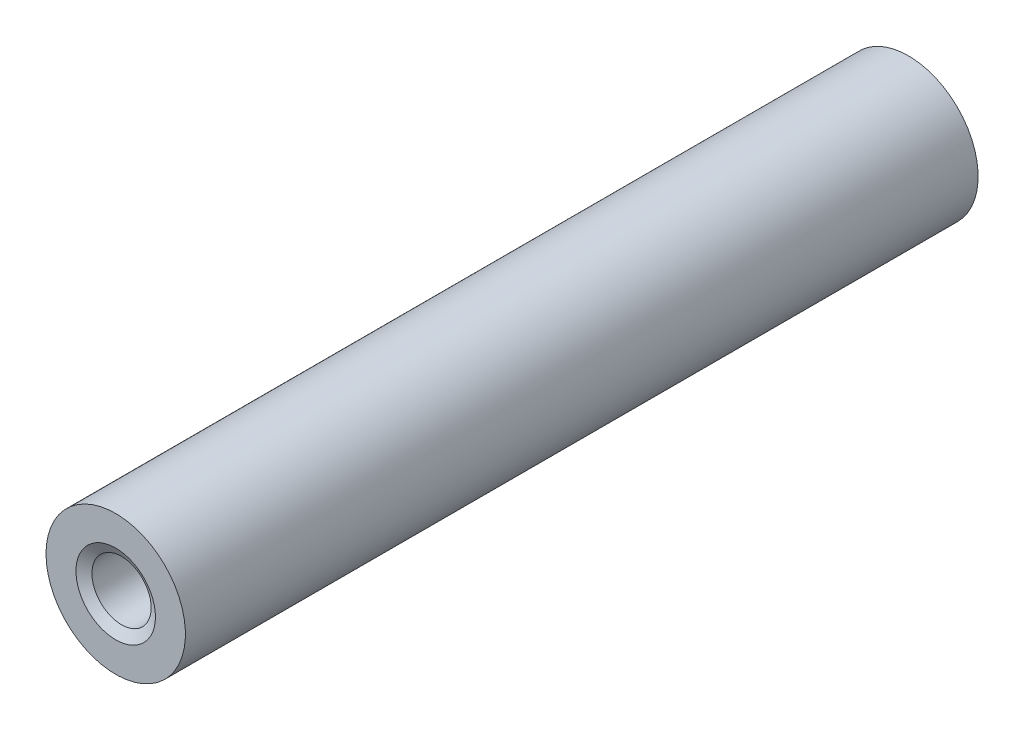
ISO-10303-21;
HEADER;
FILE_DESCRIPTION(('STEP AP214'),'2;1');
FILE_NAME('part.step','',(''),(''),'','','');
FILE_SCHEMA(('AUTOMOTIVE_DESIGN { 1 0 10303 214 1 1 1 1 }'));
ENDSEC;
DATA;
#1=APPLICATION_CONTEXT('core data for automotive mechanical design processes');
#2=APPLICATION_PROTOCOL_DEFINITION('international standard','automotive_design',2000,#1);
#3=PRODUCT_CONTEXT('',#1,'mechanical');
#4=PRODUCT('Part','Part','',(#3));
#5=PRODUCT_RELATED_PRODUCT_CATEGORY('part','',(#4));
#6=PRODUCT_DEFINITION_FORMATION('','',#4);
#7=PRODUCT_DEFINITION_CONTEXT('part definition',#1,'design');
#8=PRODUCT_DEFINITION('design','',#6,#7);
#9=PRODUCT_DEFINITION_SHAPE('','',#8);
#10=(LENGTH_UNIT() NAMED_UNIT(*) SI_UNIT(.MILLI.,.METRE.));
#11=(NAMED_UNIT(*) PLANE_ANGLE_UNIT() SI_UNIT($,.RADIAN.));
#12=(NAMED_UNIT(*) SI_UNIT($,.STERADIAN.) SOLID_ANGLE_UNIT());
#13=UNCERTAINTY_MEASURE_WITH_UNIT(LENGTH_MEASURE(1.E-05),#10,'distance_accuracy_value','');
#14=(GEOMETRIC_REPRESENTATION_CONTEXT(3) GLOBAL_UNCERTAINTY_ASSIGNED_CONTEXT((#13)) GLOBAL_UNIT_ASSIGNED_CONTEXT((#10,
#11,#12)) REPRESENTATION_CONTEXT('',''));
#15=CARTESIAN_POINT('',(0.,0.,0.));
#16=DIRECTION('',(0.,0.,1.));
#17=DIRECTION('',(1.,0.,0.));
#18=AXIS2_PLACEMENT_3D('',#15,#16,#17);
#19=CARTESIAN_POINT('',(241.510652388511,-401.151572168843,-643.087499999979));
#20=DIRECTION('',(0.,0.,-1.));
#21=DIRECTION('',(-1.,0.,0.));
#22=AXIS2_PLACEMENT_3D('',#19,#20,#21);
#23=CONICAL_SURFACE('',#22,3.39999999994048,1.02974425863138);
#24=CARTESIAN_POINT('',(241.510652388399,-401.151572168843,-641.044573895215));
#25=VERTEX_POINT('',#24);
#26=VERTEX_LOOP('',#25);
#27=FACE_BOUND('',#26,.T.);
#28=CARTESIAN_POINT('',(241.510652388511,-401.151572168843,-643.0875));
#29=DIRECTION('',(0.,0.,-1.));
#30=DIRECTION('',(-1.,0.,0.));
#31=AXIS2_PLACEMENT_3D('',#28,#29,#30);
#32=CIRCLE('',#31,3.4);
#33=CARTESIAN_POINT('',(238.110652388511,-401.151572168843,-643.0875));
#34=VERTEX_POINT('',#33);
#35=EDGE_CURVE('E38',#34,#34,#32,.T.);
#36=ORIENTED_EDGE('',*,*,#35,.T.);
#37=EDGE_LOOP('',(#36));
#38=FACE_BOUND('',#37,.T.);
#39=ADVANCED_FACE('F17',(#27,#38),#23,.F.);
#40=CARTESIAN_POINT('',(241.510652388511,-401.151572168843,-599.087500000053));
#41=DIRECTION('',(0.,0.,1.));
#42=DIRECTION('',(1.,0.,0.));
#43=AXIS2_PLACEMENT_3D('',#40,#41,#42);
#44=CONICAL_SURFACE('',#43,3.3999999999442,1.02974425864463);
#45=CARTESIAN_POINT('',(241.510652388456,-401.151572168843,-601.130426104731));
#46=VERTEX_POINT('',#45);
#47=VERTEX_LOOP('',#46);
#48=FACE_BOUND('',#47,.T.);
#49=CARTESIAN_POINT('',(241.510652388511,-401.151572168843,-599.0875));
#50=DIRECTION('',(0.,0.,1.));
#51=DIRECTION('',(1.,0.,0.));
#52=AXIS2_PLACEMENT_3D('',#49,#50,#51);
#53=CIRCLE('',#52,3.4);
#54=CARTESIAN_POINT('',(244.910652388511,-401.151572168843,-599.0875));
#55=VERTEX_POINT('',#54);
#56=EDGE_CURVE('E41',#55,#55,#53,.T.);
#57=ORIENTED_EDGE('',*,*,#56,.T.);
#58=EDGE_LOOP('',(#57));
#59=FACE_BOUND('',#58,.T.);
#60=ADVANCED_FACE('F35',(#48,#59),#44,.F.);
#61=CARTESIAN_POINT('',(241.510652388511,-401.151572168843,-666.5875));
#62=DIRECTION('',(0.,0.,-1.));
#63=DIRECTION('',(-1.,0.,0.));
#64=AXIS2_PLACEMENT_3D('',#61,#62,#63);
#65=CYLINDRICAL_SURFACE('',#64,3.4);
#66=ORIENTED_EDGE('',*,*,#35,.F.);
#67=EDGE_LOOP('',(#66));
#68=FACE_BOUND('',#67,.T.);
#69=CARTESIAN_POINT('',(241.510652388511,-401.151572168843,-665.916330312086));
#70=DIRECTION('',(0.,0.,-1.));
#71=DIRECTION('',(-1.,0.,0.));
#72=AXIS2_PLACEMENT_3D('',#69,#70,#71);
#73=CIRCLE('',#72,3.40000000005417);
#74=CARTESIAN_POINT('',(238.110652388457,-401.151572168843,-665.916330312086));
#75=VERTEX_POINT('',#74);
#76=EDGE_CURVE('E46',#75,#75,#73,.T.);
#77=ORIENTED_EDGE('',*,*,#76,.T.);
#78=EDGE_LOOP('',(#77));
#79=FACE_BOUND('',#78,.T.);
#80=ADVANCED_FACE('F71',(#68,#79),#65,.F.);
#81=CARTESIAN_POINT('',(241.510652388511,-401.151572168843,-575.5875));
#82=DIRECTION('',(0.,0.,1.));
#83=DIRECTION('',(1.,0.,0.));
#84=AXIS2_PLACEMENT_3D('',#81,#82,#83);
#85=CYLINDRICAL_SURFACE('',#84,3.4);
#86=ORIENTED_EDGE('',*,*,#56,.F.);
#87=EDGE_LOOP('',(#86));
#88=FACE_BOUND('',#87,.T.);
#89=CARTESIAN_POINT('',(241.510652388511,-401.151572168843,-576.258669688002));
#90=DIRECTION('',(0.,0.,1.));
#91=DIRECTION('',(1.,0.,0.));
#92=AXIS2_PLACEMENT_3D('',#89,#90,#91);
#93=CIRCLE('',#92,3.40000000000104);
#94=CARTESIAN_POINT('',(244.910652388512,-401.151572168843,-576.258669688002));
#95=VERTEX_POINT('',#94);
#96=EDGE_CURVE('E59',#95,#95,#93,.T.);
#97=ORIENTED_EDGE('',*,*,#96,.T.);
#98=EDGE_LOOP('',(#97));
#99=FACE_BOUND('',#98,.T.);
#100=ADVANCED_FACE('F76',(#88,#99),#85,.F.);
#101=CARTESIAN_POINT('',(241.510652388511,-401.151572168843,-666.587500000048));
#102=DIRECTION('',(0.,0.,-1.));
#103=DIRECTION('',(-1.,0.,0.));
#104=AXIS2_PLACEMENT_3D('',#101,#102,#103);
#105=CONICAL_SURFACE('',#104,4.56250000013184,1.04719755120679);
#106=CARTESIAN_POINT('',(241.510652388511,-401.151572168843,-666.587499999984));
#107=DIRECTION('',(0.,0.,-1.));
#108=DIRECTION('',(-1.,0.,0.));
#109=AXIS2_PLACEMENT_3D('',#106,#107,#108);
#110=CIRCLE('',#109,4.56250000002001);
#111=CARTESIAN_POINT('',(236.948152388491,-401.151572168843,-666.587499999984));
#112=VERTEX_POINT('',#111);
#113=EDGE_CURVE('E20',#112,#112,#110,.F.);
#114=ORIENTED_EDGE('',*,*,#113,.F.);
#115=EDGE_LOOP('',(#114));
#116=FACE_BOUND('',#115,.T.);
#117=ORIENTED_EDGE('',*,*,#76,.F.);
#118=EDGE_LOOP('',(#117));
#119=FACE_BOUND('',#118,.T.);
#120=ADVANCED_FACE('F73',(#116,#119),#105,.F.);
#121=CARTESIAN_POINT('',(241.510652388511,-401.151572168843,-575.58750000004));
#122=DIRECTION('',(0.,0.,1.));
#123=DIRECTION('',(1.,0.,0.));
#124=AXIS2_PLACEMENT_3D('',#121,#122,#123);
#125=CONICAL_SURFACE('',#124,4.56250000002187,1.04719755117994);
#126=CARTESIAN_POINT('',(241.510652388511,-401.151572168843,-575.587500000041));
#127=DIRECTION('',(0.,0.,1.));
#128=DIRECTION('',(1.,0.,0.));
#129=AXIS2_PLACEMENT_3D('',#126,#127,#128);
#130=CIRCLE('',#129,4.56250000002001);
#131=CARTESIAN_POINT('',(246.073152388531,-401.151572168843,-575.587500000041));
#132=VERTEX_POINT('',#131);
#133=EDGE_CURVE('E52',#132,#132,#130,.T.);
#134=ORIENTED_EDGE('',*,*,#133,.T.);
#135=EDGE_LOOP('',(#134));
#136=FACE_BOUND('',#135,.T.);
#137=ORIENTED_EDGE('',*,*,#96,.F.);
#138=EDGE_LOOP('',(#137));
#139=FACE_BOUND('',#138,.T.);
#140=ADVANCED_FACE('F75',(#136,#139),#125,.F.);
#141=CARTESIAN_POINT('',(401.510652388512,-401.151572168843,-666.5875));
#142=DIRECTION('',(0.,0.,-1.));
#143=DIRECTION('',(-1.,0.,0.));
#144=AXIS2_PLACEMENT_3D('',#141,#142,#143);
#145=PLANE('',#144);
#146=CARTESIAN_POINT('',(241.510652388512,-401.151572168843,-666.5875));
#147=DIRECTION('',(0.,0.,-1.));
#148=DIRECTION('',(-1.,0.,0.));
#149=AXIS2_PLACEMENT_3D('',#146,#147,#148);
#150=CIRCLE('',#149,8.);
#151=CARTESIAN_POINT('',(233.510652388512,-401.151572168843,-666.5875));
#152=VERTEX_POINT('',#151);
#153=EDGE_CURVE('E27',#152,#152,#150,.F.);
#154=ORIENTED_EDGE('',*,*,#153,.F.);
#155=EDGE_LOOP('',(#154));
#156=FACE_BOUND('',#155,.T.);
#157=ORIENTED_EDGE('',*,*,#113,.T.);
#158=EDGE_LOOP('',(#157));
#159=FACE_BOUND('',#158,.T.);
#160=ADVANCED_FACE('F83',(#156,#159),#145,.T.);
#161=CARTESIAN_POINT('',(476.510652388512,-354.095322168843,-575.5875));
#162=DIRECTION('',(0.,0.,-1.));
#163=DIRECTION('',(-1.,0.,0.));
#164=AXIS2_PLACEMENT_3D('',#161,#162,#163);
#165=PLANE('',#164);
#166=CARTESIAN_POINT('',(241.510652388512,-401.151572168843,-575.5875));
#167=DIRECTION('',(0.,0.,-1.));
#168=DIRECTION('',(-1.,0.,0.));
#169=AXIS2_PLACEMENT_3D('',#166,#167,#168);
#170=CIRCLE('',#169,8.);
#171=CARTESIAN_POINT('',(233.510652388512,-401.151572168843,-575.5875));
#172=VERTEX_POINT('',#171);
#173=EDGE_CURVE('E11',#172,#172,#170,.T.);
#174=ORIENTED_EDGE('',*,*,#173,.F.);
#175=EDGE_LOOP('',(#174));
#176=FACE_BOUND('',#175,.T.);
#177=ORIENTED_EDGE('',*,*,#133,.F.);
#178=EDGE_LOOP('',(#177));
#179=FACE_BOUND('',#178,.T.);
#180=ADVANCED_FACE('F89',(#176,#179),#165,.F.);
#181=CARTESIAN_POINT('',(241.510652388512,-401.151572168843,-686.35));
#182=DIRECTION('',(0.,0.,-1.));
#183=DIRECTION('',(-1.,0.,0.));
#184=AXIS2_PLACEMENT_3D('',#181,#182,#183);
#185=CYLINDRICAL_SURFACE('',#184,8.);
#186=ORIENTED_EDGE('',*,*,#173,.T.);
#187=EDGE_LOOP('',(#186));
#188=FACE_BOUND('',#187,.T.);
#189=ORIENTED_EDGE('',*,*,#153,.T.);
#190=EDGE_LOOP('',(#189));
#191=FACE_BOUND('',#190,.T.);
#192=ADVANCED_FACE('F87',(#188,#191),#185,.T.);
#193=CLOSED_SHELL('',(#39,#60,#80,#100,#120,#140,#160,#180,#192));
#194=MANIFOLD_SOLID_BREP('B1',#193);
#195=ADVANCED_BREP_SHAPE_REPRESENTATION('',(#18,#194),#14);
#196=SHAPE_DEFINITION_REPRESENTATION(#9,#195);
ENDSEC;
END-ISO-10303-21;
